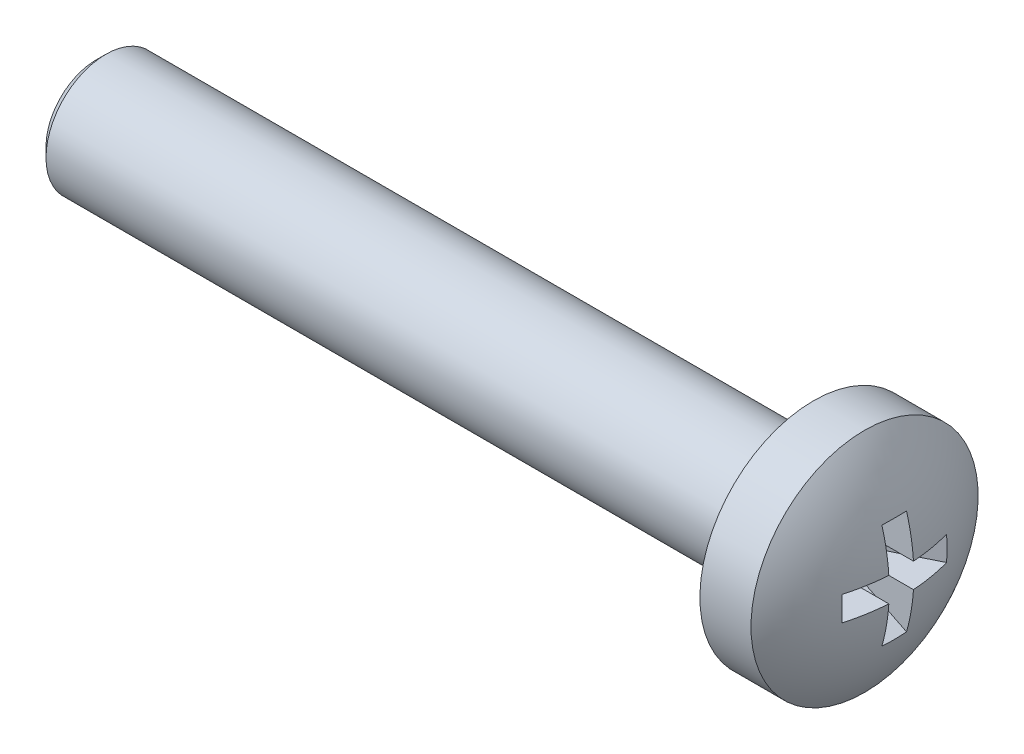
ISO-10303-21;
HEADER;
FILE_DESCRIPTION(('STEP AP214'),'2;1');
FILE_NAME('part.step','',(''),(''),'','','');
FILE_SCHEMA(('AUTOMOTIVE_DESIGN { 1 0 10303 214 1 1 1 1 }'));
ENDSEC;
DATA;
#1=APPLICATION_CONTEXT('core data for automotive mechanical design processes');
#2=APPLICATION_PROTOCOL_DEFINITION('international standard','automotive_design',2000,#1);
#3=PRODUCT_CONTEXT('',#1,'mechanical');
#4=PRODUCT('Part','Part','',(#3));
#5=PRODUCT_RELATED_PRODUCT_CATEGORY('part','',(#4));
#6=PRODUCT_DEFINITION_FORMATION('','',#4);
#7=PRODUCT_DEFINITION_CONTEXT('part definition',#1,'design');
#8=PRODUCT_DEFINITION('design','',#6,#7);
#9=PRODUCT_DEFINITION_SHAPE('','',#8);
#10=(LENGTH_UNIT() NAMED_UNIT(*) SI_UNIT(.MILLI.,.METRE.));
#11=(NAMED_UNIT(*) PLANE_ANGLE_UNIT() SI_UNIT($,.RADIAN.));
#12=(NAMED_UNIT(*) SI_UNIT($,.STERADIAN.) SOLID_ANGLE_UNIT());
#13=UNCERTAINTY_MEASURE_WITH_UNIT(LENGTH_MEASURE(1.E-05),#10,'distance_accuracy_value','');
#14=(GEOMETRIC_REPRESENTATION_CONTEXT(3) GLOBAL_UNCERTAINTY_ASSIGNED_CONTEXT((#13)) GLOBAL_UNIT_ASSIGNED_CONTEXT((#10,
#11,#12)) REPRESENTATION_CONTEXT('',''));
#15=CARTESIAN_POINT('',(0.,0.,0.));
#16=DIRECTION('',(0.,0.,1.));
#17=DIRECTION('',(1.,0.,0.));
#18=AXIS2_PLACEMENT_3D('',#15,#16,#17);
#19=CARTESIAN_POINT('',(-8.,0.,0.));
#20=DIRECTION('',(1.,0.,0.));
#21=DIRECTION('',(0.,-1.,0.));
#22=AXIS2_PLACEMENT_3D('',#19,#20,#21);
#23=SPHERICAL_SURFACE('',#22,8.);
#24=CARTESIAN_POINT('',(-7.34565681691376,0.,-1.31240938798552));
#25=DIRECTION('',(0.446197813109809,0.,-0.894934361602025));
#26=DIRECTION('',(-0.894934361602025,0.,-0.446197813109809));
#27=AXIS2_PLACEMENT_3D('',#24,#25,#26);
#28=CIRCLE('',#27,7.86444000530718);
#29=CARTESIAN_POINT('',(-0.322606080628619,0.515,2.18915454155237));
#30=VERTEX_POINT('',#29);
#31=CARTESIAN_POINT('',(-0.322606080628619,-0.515,2.18915454155237));
#32=VERTEX_POINT('',#31);
#33=EDGE_CURVE('E195',#30,#32,#28,.T.);
#34=ORIENTED_EDGE('',*,*,#33,.F.);
#35=CARTESIAN_POINT('',(-8.,0.515,0.));
#36=DIRECTION('',(0.,-1.,0.));
#37=DIRECTION('',(0.,0.,-1.));
#38=AXIS2_PLACEMENT_3D('',#35,#36,#37);
#39=CIRCLE('',#38,7.98340622792051);
#40=CARTESIAN_POINT('',(-0.0332221067736553,0.515,0.515));
#41=VERTEX_POINT('',#40);
#42=EDGE_CURVE('E114',#30,#41,#39,.F.);
#43=ORIENTED_EDGE('',*,*,#42,.T.);
#44=CARTESIAN_POINT('',(-8.,0.,0.515));
#45=DIRECTION('',(0.,0.,1.));
#46=DIRECTION('',(0.,-1.,0.));
#47=AXIS2_PLACEMENT_3D('',#44,#45,#46);
#48=CIRCLE('',#47,7.98340622792051);
#49=CARTESIAN_POINT('',(-0.32260608062862,2.18915454155236,0.515));
#50=VERTEX_POINT('',#49);
#51=EDGE_CURVE('E146',#50,#41,#48,.F.);
#52=ORIENTED_EDGE('',*,*,#51,.F.);
#53=CARTESIAN_POINT('',(-7.34565681691376,-1.31240938798552,0.));
#54=DIRECTION('',(0.446197813109809,-0.894934361602025,0.));
#55=DIRECTION('',(0.894934361602025,0.446197813109809,0.));
#56=AXIS2_PLACEMENT_3D('',#53,#54,#55);
#57=CIRCLE('',#56,7.86444000530718);
#58=CARTESIAN_POINT('',(-0.32260608062862,2.18915454155236,-0.515));
#59=VERTEX_POINT('',#58);
#60=EDGE_CURVE('E143',#50,#59,#57,.F.);
#61=ORIENTED_EDGE('',*,*,#60,.T.);
#62=CARTESIAN_POINT('',(-8.,0.,-0.515));
#63=DIRECTION('',(0.,0.,1.));
#64=DIRECTION('',(0.,-1.,0.));
#65=AXIS2_PLACEMENT_3D('',#62,#63,#64);
#66=CIRCLE('',#65,7.98340622792051);
#67=CARTESIAN_POINT('',(-0.0332221067736553,0.515,-0.515));
#68=VERTEX_POINT('',#67);
#69=EDGE_CURVE('E147',#59,#68,#66,.F.);
#70=ORIENTED_EDGE('',*,*,#69,.T.);
#71=CARTESIAN_POINT('',(-8.,0.515,0.));
#72=DIRECTION('',(0.,-1.,0.));
#73=DIRECTION('',(0.,0.,-1.));
#74=AXIS2_PLACEMENT_3D('',#71,#72,#73);
#75=CIRCLE('',#74,7.98340622792051);
#76=CARTESIAN_POINT('',(-0.322606080628619,0.515,-2.18915454155237));
#77=VERTEX_POINT('',#76);
#78=EDGE_CURVE('E197',#68,#77,#75,.F.);
#79=ORIENTED_EDGE('',*,*,#78,.T.);
#80=CARTESIAN_POINT('',(-7.34565681691376,0.,1.31240938798552));
#81=DIRECTION('',(0.446197813109809,0.,0.894934361602025));
#82=DIRECTION('',(0.894934361602025,0.,-0.446197813109809));
#83=AXIS2_PLACEMENT_3D('',#80,#81,#82);
#84=CIRCLE('',#83,7.86444000530718);
#85=CARTESIAN_POINT('',(-0.322606080628619,-0.515,-2.18915454155237));
#86=VERTEX_POINT('',#85);
#87=EDGE_CURVE('E200',#77,#86,#84,.F.);
#88=ORIENTED_EDGE('',*,*,#87,.T.);
#89=CARTESIAN_POINT('',(-8.,-0.515,0.));
#90=DIRECTION('',(0.,-1.,0.));
#91=DIRECTION('',(0.,0.,-1.));
#92=AXIS2_PLACEMENT_3D('',#89,#90,#91);
#93=CIRCLE('',#92,7.98340622792051);
#94=CARTESIAN_POINT('',(-0.0332221067736553,-0.515,-0.515));
#95=VERTEX_POINT('',#94);
#96=EDGE_CURVE('E201',#95,#86,#93,.F.);
#97=ORIENTED_EDGE('',*,*,#96,.F.);
#98=CARTESIAN_POINT('',(-8.,0.,-0.515));
#99=DIRECTION('',(0.,0.,1.));
#100=DIRECTION('',(0.,-1.,0.));
#101=AXIS2_PLACEMENT_3D('',#98,#99,#100);
#102=CIRCLE('',#101,7.98340622792051);
#103=CARTESIAN_POINT('',(-0.322606080628619,-2.18915454155237,-0.515));
#104=VERTEX_POINT('',#103);
#105=EDGE_CURVE('E157',#95,#104,#102,.F.);
#106=ORIENTED_EDGE('',*,*,#105,.T.);
#107=CARTESIAN_POINT('',(-7.34565681691376,1.31240938798552,0.));
#108=DIRECTION('',(0.446197813109809,0.894934361602025,0.));
#109=DIRECTION('',(-0.894934361602025,0.446197813109809,0.));
#110=AXIS2_PLACEMENT_3D('',#107,#108,#109);
#111=CIRCLE('',#110,7.86444000530718);
#112=CARTESIAN_POINT('',(-0.322606080628619,-2.18915454155237,0.515));
#113=VERTEX_POINT('',#112);
#114=EDGE_CURVE('E154',#113,#104,#111,.T.);
#115=ORIENTED_EDGE('',*,*,#114,.F.);
#116=CARTESIAN_POINT('',(-8.,0.,0.515));
#117=DIRECTION('',(0.,0.,1.));
#118=DIRECTION('',(0.,-1.,0.));
#119=AXIS2_PLACEMENT_3D('',#116,#117,#118);
#120=CIRCLE('',#119,7.98340622792051);
#121=CARTESIAN_POINT('',(-0.0332221067736553,-0.515,0.515));
#122=VERTEX_POINT('',#121);
#123=EDGE_CURVE('E158',#122,#113,#120,.F.);
#124=ORIENTED_EDGE('',*,*,#123,.F.);
#125=CARTESIAN_POINT('',(-8.,-0.515,0.));
#126=DIRECTION('',(0.,-1.,0.));
#127=DIRECTION('',(0.,0.,-1.));
#128=AXIS2_PLACEMENT_3D('',#125,#126,#127);
#129=CIRCLE('',#128,7.98340622792051);
#130=EDGE_CURVE('E193',#32,#122,#129,.F.);
#131=ORIENTED_EDGE('',*,*,#130,.F.);
#132=EDGE_LOOP('',(#34,#43,#52,#61,#70,#79,#88,#97,#106,#115,#124,#131));
#133=FACE_BOUND('',#132,.T.);
#134=CARTESIAN_POINT('',(-1.56280340520813,0.,0.));
#135=DIRECTION('',(1.,0.,0.));
#136=DIRECTION('',(0.,1.,0.));
#137=AXIS2_PLACEMENT_3D('',#134,#135,#136);
#138=CIRCLE('',#137,4.75);
#139=CARTESIAN_POINT('',(-1.56280340520814,4.75,0.));
#140=VERTEX_POINT('',#139);
#141=EDGE_CURVE('E118',#140,#140,#138,.T.);
#142=ORIENTED_EDGE('',*,*,#141,.T.);
#143=EDGE_LOOP('',(#142));
#144=FACE_BOUND('',#143,.T.);
#145=ADVANCED_FACE('F16',(#133,#144),#23,.T.);
#146=CARTESIAN_POINT('',(-33.7,0.,0.));
#147=DIRECTION('',(-1.,0.,0.));
#148=DIRECTION('',(0.,-1.,0.));
#149=AXIS2_PLACEMENT_3D('',#146,#147,#148);
#150=PLANE('',#149);
#151=CARTESIAN_POINT('',(-33.7,0.,0.));
#152=DIRECTION('',(-1.,0.,0.));
#153=DIRECTION('',(0.,-1.,0.));
#154=AXIS2_PLACEMENT_3D('',#151,#152,#153);
#155=CIRCLE('',#154,2.1);
#156=CARTESIAN_POINT('',(-33.7,-2.1,0.));
#157=VERTEX_POINT('',#156);
#158=EDGE_CURVE('E10',#157,#157,#155,.T.);
#159=ORIENTED_EDGE('',*,*,#158,.T.);
#160=EDGE_LOOP('',(#159));
#161=FACE_BOUND('',#160,.T.);
#162=ADVANCED_FACE('F261',(#161),#150,.T.);
#163=CARTESIAN_POINT('',(0.,0.,0.));
#164=DIRECTION('',(1.,0.,0.));
#165=DIRECTION('',(0.,1.,0.));
#166=AXIS2_PLACEMENT_3D('',#163,#164,#165);
#167=CYLINDRICAL_SURFACE('',#166,2.5);
#168=CARTESIAN_POINT('',(-33.3,0.,0.));
#169=DIRECTION('',(-1.,0.,0.));
#170=DIRECTION('',(0.,-1.,0.));
#171=AXIS2_PLACEMENT_3D('',#168,#169,#170);
#172=CIRCLE('',#171,2.5);
#173=CARTESIAN_POINT('',(-33.3,-2.5,0.));
#174=VERTEX_POINT('',#173);
#175=EDGE_CURVE('E26',#174,#174,#172,.F.);
#176=ORIENTED_EDGE('',*,*,#175,.T.);
#177=EDGE_LOOP('',(#176));
#178=FACE_BOUND('',#177,.T.);
#179=CARTESIAN_POINT('',(-3.7,0.,0.));
#180=DIRECTION('',(1.,0.,0.));
#181=DIRECTION('',(0.,1.,0.));
#182=AXIS2_PLACEMENT_3D('',#179,#180,#181);
#183=CIRCLE('',#182,2.5);
#184=CARTESIAN_POINT('',(-3.7,2.5,0.));
#185=VERTEX_POINT('',#184);
#186=EDGE_CURVE('E190',#185,#185,#183,.T.);
#187=ORIENTED_EDGE('',*,*,#186,.F.);
#188=EDGE_LOOP('',(#187));
#189=FACE_BOUND('',#188,.T.);
#190=ADVANCED_FACE('F266',(#178,#189),#167,.T.);
#191=CARTESIAN_POINT('',(-3.7,2.5,0.));
#192=DIRECTION('',(-1.,0.,0.));
#193=DIRECTION('',(0.,-1.,0.));
#194=AXIS2_PLACEMENT_3D('',#191,#192,#193);
#195=PLANE('',#194);
#196=ORIENTED_EDGE('',*,*,#186,.T.);
#197=EDGE_LOOP('',(#196));
#198=FACE_BOUND('',#197,.T.);
#199=CARTESIAN_POINT('',(-3.7,0.,0.));
#200=DIRECTION('',(1.,0.,0.));
#201=DIRECTION('',(0.,1.,0.));
#202=AXIS2_PLACEMENT_3D('',#199,#200,#201);
#203=CIRCLE('',#202,4.75);
#204=CARTESIAN_POINT('',(-3.7,4.75,0.));
#205=VERTEX_POINT('',#204);
#206=EDGE_CURVE('E187',#205,#205,#203,.T.);
#207=ORIENTED_EDGE('',*,*,#206,.F.);
#208=EDGE_LOOP('',(#207));
#209=FACE_BOUND('',#208,.T.);
#210=ADVANCED_FACE('F295',(#198,#209),#195,.T.);
#211=CARTESIAN_POINT('',(0.,0.,0.));
#212=DIRECTION('',(1.,0.,0.));
#213=DIRECTION('',(0.,1.,0.));
#214=AXIS2_PLACEMENT_3D('',#211,#212,#213);
#215=CYLINDRICAL_SURFACE('',#214,4.75);
#216=ORIENTED_EDGE('',*,*,#206,.T.);
#217=EDGE_LOOP('',(#216));
#218=FACE_BOUND('',#217,.T.);
#219=ORIENTED_EDGE('',*,*,#141,.F.);
#220=EDGE_LOOP('',(#219));
#221=FACE_BOUND('',#220,.T.);
#222=ADVANCED_FACE('F292',(#218,#221),#215,.T.);
#223=CARTESIAN_POINT('',(0.,0.,2.35));
#224=DIRECTION('',(0.446197813109809,0.,-0.894934361602025));
#225=DIRECTION('',(-0.894934361602025,0.,-0.446197813109809));
#226=AXIS2_PLACEMENT_3D('',#223,#224,#225);
#227=PLANE('',#226);
#228=ORIENTED_EDGE('',*,*,#33,.T.);
#229=DIRECTION('',(-0.894934361602025,0.,-0.446197813109809));
#230=VECTOR('',#229,1.);
#231=CARTESIAN_POINT('',(0.,-0.515,2.35));
#232=LINE('',#231,#230);
#233=CARTESIAN_POINT('',(-2.74,-0.515,0.983886393933594));
#234=VERTEX_POINT('',#233);
#235=EDGE_CURVE('E35',#234,#32,#232,.F.);
#236=ORIENTED_EDGE('',*,*,#235,.F.);
#237=DIRECTION('',(0.,1.,0.));
#238=VECTOR('',#237,1.);
#239=CARTESIAN_POINT('',(-2.74,0.,0.983886393933595));
#240=LINE('',#239,#238);
#241=CARTESIAN_POINT('',(-2.74,0.515,0.983886393933595));
#242=VERTEX_POINT('',#241);
#243=EDGE_CURVE('E126',#242,#234,#240,.F.);
#244=ORIENTED_EDGE('',*,*,#243,.F.);
#245=DIRECTION('',(-0.894934361602025,0.,-0.446197813109809));
#246=VECTOR('',#245,1.);
#247=CARTESIAN_POINT('',(0.,0.515,2.35));
#248=LINE('',#247,#246);
#249=EDGE_CURVE('E107',#242,#30,#248,.F.);
#250=ORIENTED_EDGE('',*,*,#249,.T.);
#251=EDGE_LOOP('',(#228,#236,#244,#250));
#252=FACE_BOUND('',#251,.T.);
#253=ADVANCED_FACE('F18',(#252),#227,.T.);
#254=CARTESIAN_POINT('',(-2.74,0.515,0.));
#255=DIRECTION('',(0.,-1.,0.));
#256=DIRECTION('',(0.,0.,-1.));
#257=AXIS2_PLACEMENT_3D('',#254,#255,#256);
#258=PLANE('',#257);
#259=ORIENTED_EDGE('',*,*,#249,.F.);
#260=DIRECTION('',(0.,0.,-1.));
#261=VECTOR('',#260,1.);
#262=CARTESIAN_POINT('',(-2.74,0.515,0.));
#263=LINE('',#262,#261);
#264=CARTESIAN_POINT('',(-2.74,0.515,0.515));
#265=VERTEX_POINT('',#264);
#266=EDGE_CURVE('E111',#242,#265,#263,.T.);
#267=ORIENTED_EDGE('',*,*,#266,.T.);
#268=DIRECTION('',(1.,0.,0.));
#269=VECTOR('',#268,1.);
#270=CARTESIAN_POINT('',(-2.74,0.515,0.515));
#271=LINE('',#270,#269);
#272=EDGE_CURVE('E119',#265,#41,#271,.T.);
#273=ORIENTED_EDGE('',*,*,#272,.T.);
#274=ORIENTED_EDGE('',*,*,#42,.F.);
#275=EDGE_LOOP('',(#259,#267,#273,#274));
#276=FACE_BOUND('',#275,.T.);
#277=ADVANCED_FACE('F109',(#276),#258,.T.);
#278=CARTESIAN_POINT('',(-2.74,0.,0.515));
#279=DIRECTION('',(0.,0.,1.));
#280=DIRECTION('',(0.,-1.,0.));
#281=AXIS2_PLACEMENT_3D('',#278,#279,#280);
#282=PLANE('',#281);
#283=ORIENTED_EDGE('',*,*,#51,.T.);
#284=ORIENTED_EDGE('',*,*,#272,.F.);
#285=DIRECTION('',(0.,-1.,0.));
#286=VECTOR('',#285,1.);
#287=CARTESIAN_POINT('',(-2.74,0.,0.515));
#288=LINE('',#287,#286);
#289=CARTESIAN_POINT('',(-2.74,0.983886393933595,0.515));
#290=VERTEX_POINT('',#289);
#291=EDGE_CURVE('E129',#290,#265,#288,.T.);
#292=ORIENTED_EDGE('',*,*,#291,.F.);
#293=DIRECTION('',(0.894934361602025,0.446197813109809,0.));
#294=VECTOR('',#293,1.);
#295=CARTESIAN_POINT('',(-3.13288330602388,0.788002003438862,0.515));
#296=LINE('',#295,#294);
#297=EDGE_CURVE('E139',#290,#50,#296,.T.);
#298=ORIENTED_EDGE('',*,*,#297,.T.);
#299=EDGE_LOOP('',(#283,#284,#292,#298));
#300=FACE_BOUND('',#299,.T.);
#301=ADVANCED_FACE('F250',(#300),#282,.F.);
#302=CARTESIAN_POINT('',(0.,2.35,0.));
#303=DIRECTION('',(0.446197813109809,-0.894934361602025,0.));
#304=DIRECTION('',(0.894934361602025,0.446197813109809,0.));
#305=AXIS2_PLACEMENT_3D('',#302,#303,#304);
#306=PLANE('',#305);
#307=ORIENTED_EDGE('',*,*,#297,.F.);
#308=DIRECTION('',(0.,0.,-1.));
#309=VECTOR('',#308,1.);
#310=CARTESIAN_POINT('',(-2.74,0.983886393933595,0.));
#311=LINE('',#310,#309);
#312=CARTESIAN_POINT('',(-2.74,0.983886393933595,-0.515));
#313=VERTEX_POINT('',#312);
#314=EDGE_CURVE('E151',#290,#313,#311,.T.);
#315=ORIENTED_EDGE('',*,*,#314,.T.);
#316=DIRECTION('',(0.894934361602025,0.446197813109809,0.));
#317=VECTOR('',#316,1.);
#318=CARTESIAN_POINT('',(-3.13288330602388,0.788002003438862,-0.515));
#319=LINE('',#318,#317);
#320=EDGE_CURVE('E142',#313,#59,#319,.T.);
#321=ORIENTED_EDGE('',*,*,#320,.T.);
#322=ORIENTED_EDGE('',*,*,#60,.F.);
#323=EDGE_LOOP('',(#307,#315,#321,#322));
#324=FACE_BOUND('',#323,.T.);
#325=ADVANCED_FACE('F248',(#324),#306,.T.);
#326=CARTESIAN_POINT('',(-2.74,0.,-0.515));
#327=DIRECTION('',(0.,0.,1.));
#328=DIRECTION('',(0.,-1.,0.));
#329=AXIS2_PLACEMENT_3D('',#326,#327,#328);
#330=PLANE('',#329);
#331=ORIENTED_EDGE('',*,*,#320,.F.);
#332=DIRECTION('',(0.,-1.,0.));
#333=VECTOR('',#332,1.);
#334=CARTESIAN_POINT('',(-2.74,0.,-0.515));
#335=LINE('',#334,#333);
#336=CARTESIAN_POINT('',(-2.74,0.515,-0.515));
#337=VERTEX_POINT('',#336);
#338=EDGE_CURVE('E153',#313,#337,#335,.T.);
#339=ORIENTED_EDGE('',*,*,#338,.T.);
#340=DIRECTION('',(1.,0.,0.));
#341=VECTOR('',#340,1.);
#342=CARTESIAN_POINT('',(-2.74,0.515,-0.515));
#343=LINE('',#342,#341);
#344=EDGE_CURVE('E150',#337,#68,#343,.T.);
#345=ORIENTED_EDGE('',*,*,#344,.T.);
#346=ORIENTED_EDGE('',*,*,#69,.F.);
#347=EDGE_LOOP('',(#331,#339,#345,#346));
#348=FACE_BOUND('',#347,.T.);
#349=ADVANCED_FACE('F245',(#348),#330,.T.);
#350=CARTESIAN_POINT('',(-2.74,0.515,0.));
#351=DIRECTION('',(0.,-1.,0.));
#352=DIRECTION('',(0.,0.,-1.));
#353=AXIS2_PLACEMENT_3D('',#350,#351,#352);
#354=PLANE('',#353);
#355=ORIENTED_EDGE('',*,*,#344,.F.);
#356=DIRECTION('',(0.,0.,-1.));
#357=VECTOR('',#356,1.);
#358=CARTESIAN_POINT('',(-2.74,0.515,0.));
#359=LINE('',#358,#357);
#360=CARTESIAN_POINT('',(-2.74,0.515,-0.983886393933595));
#361=VERTEX_POINT('',#360);
#362=EDGE_CURVE('E173',#337,#361,#359,.T.);
#363=ORIENTED_EDGE('',*,*,#362,.T.);
#364=DIRECTION('',(0.894934361602025,0.,-0.446197813109809));
#365=VECTOR('',#364,1.);
#366=CARTESIAN_POINT('',(0.,0.515,-2.35));
#367=LINE('',#366,#365);
#368=EDGE_CURVE('E180',#361,#77,#367,.T.);
#369=ORIENTED_EDGE('',*,*,#368,.T.);
#370=ORIENTED_EDGE('',*,*,#78,.F.);
#371=EDGE_LOOP('',(#355,#363,#369,#370));
#372=FACE_BOUND('',#371,.T.);
#373=ADVANCED_FACE('F242',(#372),#354,.T.);
#374=CARTESIAN_POINT('',(0.,0.,-2.35));
#375=DIRECTION('',(0.446197813109809,0.,0.894934361602025));
#376=DIRECTION('',(0.894934361602025,0.,-0.446197813109809));
#377=AXIS2_PLACEMENT_3D('',#374,#375,#376);
#378=PLANE('',#377);
#379=ORIENTED_EDGE('',*,*,#368,.F.);
#380=DIRECTION('',(0.,-1.,0.));
#381=VECTOR('',#380,1.);
#382=CARTESIAN_POINT('',(-2.74,0.,-0.983886393933595));
#383=LINE('',#382,#381);
#384=CARTESIAN_POINT('',(-2.74,-0.515,-0.983886393933594));
#385=VERTEX_POINT('',#384);
#386=EDGE_CURVE('E172',#361,#385,#383,.T.);
#387=ORIENTED_EDGE('',*,*,#386,.T.);
#388=DIRECTION('',(0.894934361602025,0.,-0.446197813109809));
#389=VECTOR('',#388,1.);
#390=CARTESIAN_POINT('',(0.,-0.515,-2.35));
#391=LINE('',#390,#389);
#392=EDGE_CURVE('E182',#385,#86,#391,.T.);
#393=ORIENTED_EDGE('',*,*,#392,.T.);
#394=ORIENTED_EDGE('',*,*,#87,.F.);
#395=EDGE_LOOP('',(#379,#387,#393,#394));
#396=FACE_BOUND('',#395,.T.);
#397=ADVANCED_FACE('F236',(#396),#378,.T.);
#398=CARTESIAN_POINT('',(-2.74,-0.515,0.));
#399=DIRECTION('',(0.,-1.,0.));
#400=DIRECTION('',(0.,0.,-1.));
#401=AXIS2_PLACEMENT_3D('',#398,#399,#400);
#402=PLANE('',#401);
#403=ORIENTED_EDGE('',*,*,#96,.T.);
#404=ORIENTED_EDGE('',*,*,#392,.F.);
#405=DIRECTION('',(0.,0.,-1.));
#406=VECTOR('',#405,1.);
#407=CARTESIAN_POINT('',(-2.74,-0.515,0.));
#408=LINE('',#407,#406);
#409=CARTESIAN_POINT('',(-2.74,-0.515,-0.515));
#410=VERTEX_POINT('',#409);
#411=EDGE_CURVE('E165',#410,#385,#408,.T.);
#412=ORIENTED_EDGE('',*,*,#411,.F.);
#413=DIRECTION('',(1.,0.,0.));
#414=VECTOR('',#413,1.);
#415=CARTESIAN_POINT('',(-2.74,-0.515,-0.515));
#416=LINE('',#415,#414);
#417=EDGE_CURVE('E79',#410,#95,#416,.T.);
#418=ORIENTED_EDGE('',*,*,#417,.T.);
#419=EDGE_LOOP('',(#403,#404,#412,#418));
#420=FACE_BOUND('',#419,.T.);
#421=ADVANCED_FACE('F232',(#420),#402,.F.);
#422=CARTESIAN_POINT('',(-2.74,0.,-0.515));
#423=DIRECTION('',(0.,0.,1.));
#424=DIRECTION('',(0.,-1.,0.));
#425=AXIS2_PLACEMENT_3D('',#422,#423,#424);
#426=PLANE('',#425);
#427=ORIENTED_EDGE('',*,*,#417,.F.);
#428=DIRECTION('',(0.,-1.,0.));
#429=VECTOR('',#428,1.);
#430=CARTESIAN_POINT('',(-2.74,0.,-0.515));
#431=LINE('',#430,#429);
#432=CARTESIAN_POINT('',(-2.74,-0.983886393933595,-0.515));
#433=VERTEX_POINT('',#432);
#434=EDGE_CURVE('E73',#410,#433,#431,.T.);
#435=ORIENTED_EDGE('',*,*,#434,.T.);
#436=DIRECTION('',(-0.894934361602025,0.446197813109809,0.));
#437=VECTOR('',#436,1.);
#438=CARTESIAN_POINT('',(-3.13288330602388,-0.788002003438862,-0.515));
#439=LINE('',#438,#437);
#440=EDGE_CURVE('E20',#433,#104,#439,.F.);
#441=ORIENTED_EDGE('',*,*,#440,.T.);
#442=ORIENTED_EDGE('',*,*,#105,.F.);
#443=EDGE_LOOP('',(#427,#435,#441,#442));
#444=FACE_BOUND('',#443,.T.);
#445=ADVANCED_FACE('F228',(#444),#426,.T.);
#446=CARTESIAN_POINT('',(0.,-2.35,0.));
#447=DIRECTION('',(0.446197813109809,0.894934361602025,0.));
#448=DIRECTION('',(-0.894934361602025,0.446197813109809,0.));
#449=AXIS2_PLACEMENT_3D('',#446,#447,#448);
#450=PLANE('',#449);
#451=ORIENTED_EDGE('',*,*,#114,.T.);
#452=ORIENTED_EDGE('',*,*,#440,.F.);
#453=DIRECTION('',(0.,0.,1.));
#454=VECTOR('',#453,1.);
#455=CARTESIAN_POINT('',(-2.74,-0.983886393933595,0.));
#456=LINE('',#455,#454);
#457=CARTESIAN_POINT('',(-2.74,-0.983886393933595,0.515));
#458=VERTEX_POINT('',#457);
#459=EDGE_CURVE('E161',#458,#433,#456,.F.);
#460=ORIENTED_EDGE('',*,*,#459,.F.);
#461=DIRECTION('',(-0.894934361602025,0.446197813109809,0.));
#462=VECTOR('',#461,1.);
#463=CARTESIAN_POINT('',(-3.13288330602388,-0.788002003438862,0.515));
#464=LINE('',#463,#462);
#465=EDGE_CURVE('E159',#458,#113,#464,.F.);
#466=ORIENTED_EDGE('',*,*,#465,.T.);
#467=EDGE_LOOP('',(#451,#452,#460,#466));
#468=FACE_BOUND('',#467,.T.);
#469=ADVANCED_FACE('F227',(#468),#450,.T.);
#470=CARTESIAN_POINT('',(-2.74,0.,0.515));
#471=DIRECTION('',(0.,0.,1.));
#472=DIRECTION('',(0.,-1.,0.));
#473=AXIS2_PLACEMENT_3D('',#470,#471,#472);
#474=PLANE('',#473);
#475=ORIENTED_EDGE('',*,*,#123,.T.);
#476=ORIENTED_EDGE('',*,*,#465,.F.);
#477=DIRECTION('',(0.,-1.,0.));
#478=VECTOR('',#477,1.);
#479=CARTESIAN_POINT('',(-2.74,0.,0.515));
#480=LINE('',#479,#478);
#481=CARTESIAN_POINT('',(-2.74,-0.515,0.515));
#482=VERTEX_POINT('',#481);
#483=EDGE_CURVE('E133',#482,#458,#480,.T.);
#484=ORIENTED_EDGE('',*,*,#483,.F.);
#485=DIRECTION('',(1.,0.,0.));
#486=VECTOR('',#485,1.);
#487=CARTESIAN_POINT('',(-2.74,-0.515,0.515));
#488=LINE('',#487,#486);
#489=EDGE_CURVE('E138',#482,#122,#488,.T.);
#490=ORIENTED_EDGE('',*,*,#489,.T.);
#491=EDGE_LOOP('',(#475,#476,#484,#490));
#492=FACE_BOUND('',#491,.T.);
#493=ADVANCED_FACE('F225',(#492),#474,.F.);
#494=CARTESIAN_POINT('',(-2.74,-0.515,0.));
#495=DIRECTION('',(0.,-1.,0.));
#496=DIRECTION('',(0.,0.,-1.));
#497=AXIS2_PLACEMENT_3D('',#494,#495,#496);
#498=PLANE('',#497);
#499=ORIENTED_EDGE('',*,*,#130,.T.);
#500=ORIENTED_EDGE('',*,*,#489,.F.);
#501=DIRECTION('',(0.,0.,-1.));
#502=VECTOR('',#501,1.);
#503=CARTESIAN_POINT('',(-2.74,-0.515,0.));
#504=LINE('',#503,#502);
#505=EDGE_CURVE('E131',#234,#482,#504,.T.);
#506=ORIENTED_EDGE('',*,*,#505,.F.);
#507=ORIENTED_EDGE('',*,*,#235,.T.);
#508=EDGE_LOOP('',(#499,#500,#506,#507));
#509=FACE_BOUND('',#508,.T.);
#510=ADVANCED_FACE('F223',(#509),#498,.F.);
#511=CARTESIAN_POINT('',(-2.74,0.,0.));
#512=DIRECTION('',(1.,0.,0.));
#513=DIRECTION('',(0.,0.,-1.));
#514=AXIS2_PLACEMENT_3D('',#511,#512,#513);
#515=PLANE('',#514);
#516=ORIENTED_EDGE('',*,*,#243,.T.);
#517=ORIENTED_EDGE('',*,*,#505,.T.);
#518=ORIENTED_EDGE('',*,*,#483,.T.);
#519=ORIENTED_EDGE('',*,*,#459,.T.);
#520=ORIENTED_EDGE('',*,*,#434,.F.);
#521=ORIENTED_EDGE('',*,*,#411,.T.);
#522=ORIENTED_EDGE('',*,*,#386,.F.);
#523=ORIENTED_EDGE('',*,*,#362,.F.);
#524=ORIENTED_EDGE('',*,*,#338,.F.);
#525=ORIENTED_EDGE('',*,*,#314,.F.);
#526=ORIENTED_EDGE('',*,*,#291,.T.);
#527=ORIENTED_EDGE('',*,*,#266,.F.);
#528=EDGE_LOOP('',(#516,#517,#518,#519,#520,#521,#522,#523,#524,#525,#526,#527));
#529=FACE_BOUND('',#528,.T.);
#530=ADVANCED_FACE('F124',(#529),#515,.T.);
#531=CARTESIAN_POINT('',(-33.3,0.,0.));
#532=DIRECTION('',(1.,0.,0.));
#533=DIRECTION('',(0.,1.,0.));
#534=AXIS2_PLACEMENT_3D('',#531,#532,#533);
#535=CONICAL_SURFACE('',#534,2.5,0.785398163397444);
#536=ORIENTED_EDGE('',*,*,#158,.F.);
#537=EDGE_LOOP('',(#536));
#538=FACE_BOUND('',#537,.T.);
#539=ORIENTED_EDGE('',*,*,#175,.F.);
#540=EDGE_LOOP('',(#539));
#541=FACE_BOUND('',#540,.T.);
#542=ADVANCED_FACE('F271',(#538,#541),#535,.T.);
#543=CLOSED_SHELL('',(#145,#162,#190,#210,#222,#253,#277,#301,#325,#349,#373,#397,#421,#445,
#469,#493,#510,#530,#542));
#544=MANIFOLD_SOLID_BREP('B1',#543);
#545=ADVANCED_BREP_SHAPE_REPRESENTATION('',(#18,#544),#14);
#546=SHAPE_DEFINITION_REPRESENTATION(#9,#545);
ENDSEC;
END-ISO-10303-21;
